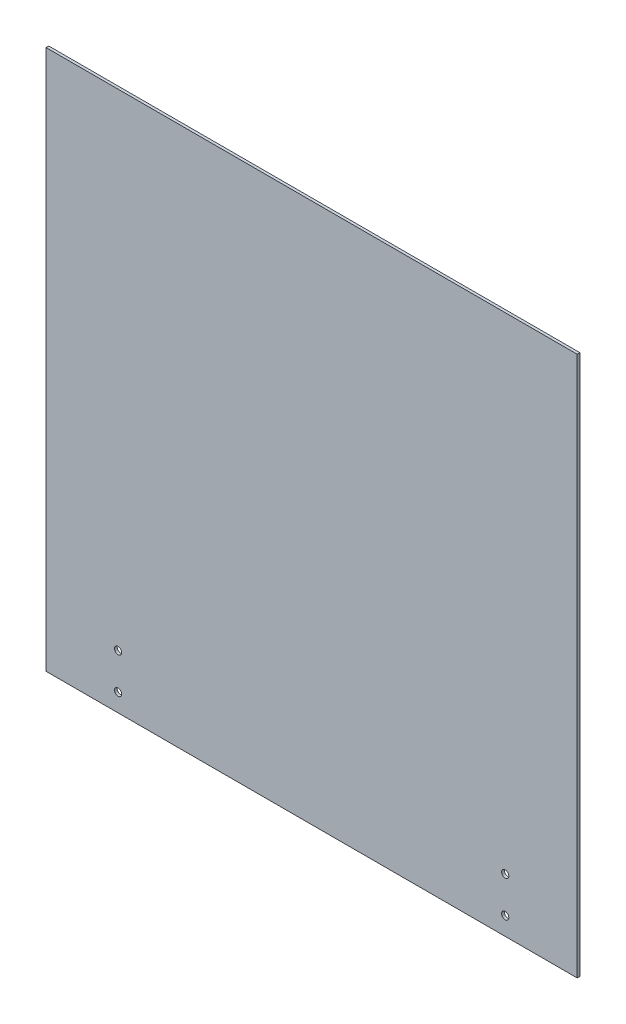
ISO-10303-21;
HEADER;
FILE_DESCRIPTION(('STEP AP214'),'2;1');
FILE_NAME('part.step','',(''),(''),'','','');
FILE_SCHEMA(('AUTOMOTIVE_DESIGN { 1 0 10303 214 1 1 1 1 }'));
ENDSEC;
DATA;
#1=APPLICATION_CONTEXT('core data for automotive mechanical design processes');
#2=APPLICATION_PROTOCOL_DEFINITION('international standard','automotive_design',2000,#1);
#3=PRODUCT_CONTEXT('',#1,'mechanical');
#4=PRODUCT('Part','Part','',(#3));
#5=PRODUCT_RELATED_PRODUCT_CATEGORY('part','',(#4));
#6=PRODUCT_DEFINITION_FORMATION('','',#4);
#7=PRODUCT_DEFINITION_CONTEXT('part definition',#1,'design');
#8=PRODUCT_DEFINITION('design','',#6,#7);
#9=PRODUCT_DEFINITION_SHAPE('','',#8);
#10=(LENGTH_UNIT() NAMED_UNIT(*) SI_UNIT(.MILLI.,.METRE.));
#11=(NAMED_UNIT(*) PLANE_ANGLE_UNIT() SI_UNIT($,.RADIAN.));
#12=(NAMED_UNIT(*) SI_UNIT($,.STERADIAN.) SOLID_ANGLE_UNIT());
#13=UNCERTAINTY_MEASURE_WITH_UNIT(LENGTH_MEASURE(1.E-05),#10,'distance_accuracy_value','');
#14=(GEOMETRIC_REPRESENTATION_CONTEXT(3) GLOBAL_UNCERTAINTY_ASSIGNED_CONTEXT((#13)) GLOBAL_UNIT_ASSIGNED_CONTEXT((#10,
#11,#12)) REPRESENTATION_CONTEXT('',''));
#15=CARTESIAN_POINT('',(0.,0.,0.));
#16=DIRECTION('',(0.,0.,1.));
#17=DIRECTION('',(1.,0.,0.));
#18=AXIS2_PLACEMENT_3D('',#15,#16,#17);
#19=CARTESIAN_POINT('',(147.5,-150.,-1.5));
#20=DIRECTION('',(1.,0.,0.));
#21=DIRECTION('',(0.,0.,-1.));
#22=AXIS2_PLACEMENT_3D('',#19,#20,#21);
#23=PLANE('',#22);
#24=DIRECTION('',(0.,1.,0.));
#25=VECTOR('',#24,1.);
#26=CARTESIAN_POINT('',(147.5,-150.,0.));
#27=LINE('',#26,#25);
#28=CARTESIAN_POINT('',(147.5,-150.,0.));
#29=VERTEX_POINT('',#28);
#30=CARTESIAN_POINT('',(147.5,150.,0.));
#31=VERTEX_POINT('',#30);
#32=EDGE_CURVE('E104',#29,#31,#27,.T.);
#33=ORIENTED_EDGE('',*,*,#32,.F.);
#34=DIRECTION('',(0.,0.,1.));
#35=VECTOR('',#34,1.);
#36=CARTESIAN_POINT('',(147.5,-150.,-1.5));
#37=LINE('',#36,#35);
#38=CARTESIAN_POINT('',(147.5,-150.,-1.5));
#39=VERTEX_POINT('',#38);
#40=EDGE_CURVE('E11',#39,#29,#37,.T.);
#41=ORIENTED_EDGE('',*,*,#40,.F.);
#42=DIRECTION('',(0.,1.,0.));
#43=VECTOR('',#42,1.);
#44=CARTESIAN_POINT('',(147.5,-150.,-1.5));
#45=LINE('',#44,#43);
#46=CARTESIAN_POINT('',(147.5,150.,-1.5));
#47=VERTEX_POINT('',#46);
#48=EDGE_CURVE('E97',#39,#47,#45,.T.);
#49=ORIENTED_EDGE('',*,*,#48,.T.);
#50=DIRECTION('',(0.,0.,1.));
#51=VECTOR('',#50,1.);
#52=CARTESIAN_POINT('',(147.5,150.,-1.5));
#53=LINE('',#52,#51);
#54=EDGE_CURVE('E42',#47,#31,#53,.T.);
#55=ORIENTED_EDGE('',*,*,#54,.T.);
#56=EDGE_LOOP('',(#33,#41,#49,#55));
#57=FACE_BOUND('',#56,.T.);
#58=ADVANCED_FACE('F39',(#57),#23,.T.);
#59=CARTESIAN_POINT('',(-147.5,-150.,-1.5));
#60=DIRECTION('',(0.,-1.,0.));
#61=DIRECTION('',(0.,0.,-1.));
#62=AXIS2_PLACEMENT_3D('',#59,#60,#61);
#63=PLANE('',#62);
#64=DIRECTION('',(1.,0.,0.));
#65=VECTOR('',#64,1.);
#66=CARTESIAN_POINT('',(-147.5,-150.,0.));
#67=LINE('',#66,#65);
#68=CARTESIAN_POINT('',(-147.5,-150.,0.));
#69=VERTEX_POINT('',#68);
#70=EDGE_CURVE('E99',#69,#29,#67,.T.);
#71=ORIENTED_EDGE('',*,*,#70,.F.);
#72=DIRECTION('',(0.,0.,1.));
#73=VECTOR('',#72,1.);
#74=CARTESIAN_POINT('',(-147.5,-150.,-1.5));
#75=LINE('',#74,#73);
#76=CARTESIAN_POINT('',(-147.5,-150.,-1.5));
#77=VERTEX_POINT('',#76);
#78=EDGE_CURVE('E48',#77,#69,#75,.T.);
#79=ORIENTED_EDGE('',*,*,#78,.F.);
#80=DIRECTION('',(1.,0.,0.));
#81=VECTOR('',#80,1.);
#82=CARTESIAN_POINT('',(-147.5,-150.,-1.5));
#83=LINE('',#82,#81);
#84=EDGE_CURVE('E94',#77,#39,#83,.T.);
#85=ORIENTED_EDGE('',*,*,#84,.T.);
#86=ORIENTED_EDGE('',*,*,#40,.T.);
#87=EDGE_LOOP('',(#71,#79,#85,#86));
#88=FACE_BOUND('',#87,.T.);
#89=ADVANCED_FACE('F115',(#88),#63,.T.);
#90=CARTESIAN_POINT('',(-147.5,-150.,-1.5));
#91=DIRECTION('',(-1.,0.,0.));
#92=DIRECTION('',(0.,0.,1.));
#93=AXIS2_PLACEMENT_3D('',#90,#91,#92);
#94=PLANE('',#93);
#95=DIRECTION('',(0.,-1.,0.));
#96=VECTOR('',#95,1.);
#97=CARTESIAN_POINT('',(-147.5,-150.,0.));
#98=LINE('',#97,#96);
#99=CARTESIAN_POINT('',(-147.5,150.,0.));
#100=VERTEX_POINT('',#99);
#101=EDGE_CURVE('E89',#100,#69,#98,.T.);
#102=ORIENTED_EDGE('',*,*,#101,.F.);
#103=DIRECTION('',(0.,0.,1.));
#104=VECTOR('',#103,1.);
#105=CARTESIAN_POINT('',(-147.5,150.,-1.5));
#106=LINE('',#105,#104);
#107=CARTESIAN_POINT('',(-147.5,150.,-1.5));
#108=VERTEX_POINT('',#107);
#109=EDGE_CURVE('E84',#108,#100,#106,.T.);
#110=ORIENTED_EDGE('',*,*,#109,.F.);
#111=DIRECTION('',(0.,-1.,0.));
#112=VECTOR('',#111,1.);
#113=CARTESIAN_POINT('',(-147.5,-150.,-1.5));
#114=LINE('',#113,#112);
#115=EDGE_CURVE('E87',#108,#77,#114,.T.);
#116=ORIENTED_EDGE('',*,*,#115,.T.);
#117=ORIENTED_EDGE('',*,*,#78,.T.);
#118=EDGE_LOOP('',(#102,#110,#116,#117));
#119=FACE_BOUND('',#118,.T.);
#120=ADVANCED_FACE('F86',(#119),#94,.T.);
#121=CARTESIAN_POINT('',(-147.5,150.,-1.5));
#122=DIRECTION('',(0.,1.,0.));
#123=DIRECTION('',(0.,0.,1.));
#124=AXIS2_PLACEMENT_3D('',#121,#122,#123);
#125=PLANE('',#124);
#126=DIRECTION('',(-1.,0.,0.));
#127=VECTOR('',#126,1.);
#128=CARTESIAN_POINT('',(-147.5,150.,0.));
#129=LINE('',#128,#127);
#130=EDGE_CURVE('E107',#31,#100,#129,.T.);
#131=ORIENTED_EDGE('',*,*,#130,.F.);
#132=ORIENTED_EDGE('',*,*,#54,.F.);
#133=DIRECTION('',(-1.,0.,0.));
#134=VECTOR('',#133,1.);
#135=CARTESIAN_POINT('',(-147.5,150.,-1.5));
#136=LINE('',#135,#134);
#137=EDGE_CURVE('E93',#47,#108,#136,.T.);
#138=ORIENTED_EDGE('',*,*,#137,.T.);
#139=ORIENTED_EDGE('',*,*,#109,.T.);
#140=EDGE_LOOP('',(#131,#132,#138,#139));
#141=FACE_BOUND('',#140,.T.);
#142=ADVANCED_FACE('F96',(#141),#125,.T.);
#143=CARTESIAN_POINT('',(0.,0.,-1.5));
#144=DIRECTION('',(0.,0.,-1.));
#145=DIRECTION('',(-1.,0.,0.));
#146=AXIS2_PLACEMENT_3D('',#143,#144,#145);
#147=PLANE('',#146);
#148=CARTESIAN_POINT('',(-107.5,-140.,-1.5));
#149=DIRECTION('',(0.,0.,1.));
#150=DIRECTION('',(1.,0.,0.));
#151=AXIS2_PLACEMENT_3D('',#148,#149,#150);
#152=CIRCLE('',#151,2.);
#153=CARTESIAN_POINT('',(-105.5,-140.,-1.5));
#154=VERTEX_POINT('',#153);
#155=EDGE_CURVE('E156',#154,#154,#152,.T.);
#156=ORIENTED_EDGE('',*,*,#155,.T.);
#157=EDGE_LOOP('',(#156));
#158=FACE_BOUND('',#157,.T.);
#159=CARTESIAN_POINT('',(-107.5,-120.,-1.5));
#160=DIRECTION('',(0.,0.,1.));
#161=DIRECTION('',(1.,0.,0.));
#162=AXIS2_PLACEMENT_3D('',#159,#160,#161);
#163=CIRCLE('',#162,2.);
#164=CARTESIAN_POINT('',(-105.5,-120.,-1.5));
#165=VERTEX_POINT('',#164);
#166=EDGE_CURVE('E164',#165,#165,#163,.T.);
#167=ORIENTED_EDGE('',*,*,#166,.T.);
#168=EDGE_LOOP('',(#167));
#169=FACE_BOUND('',#168,.T.);
#170=CARTESIAN_POINT('',(107.5,-120.,-1.5));
#171=DIRECTION('',(0.,0.,1.));
#172=DIRECTION('',(1.,0.,0.));
#173=AXIS2_PLACEMENT_3D('',#170,#171,#172);
#174=CIRCLE('',#173,2.);
#175=CARTESIAN_POINT('',(109.5,-120.,-1.5));
#176=VERTEX_POINT('',#175);
#177=EDGE_CURVE('E170',#176,#176,#174,.T.);
#178=ORIENTED_EDGE('',*,*,#177,.T.);
#179=EDGE_LOOP('',(#178));
#180=FACE_BOUND('',#179,.T.);
#181=CARTESIAN_POINT('',(107.5,-140.,-1.5));
#182=DIRECTION('',(0.,0.,1.));
#183=DIRECTION('',(1.,0.,0.));
#184=AXIS2_PLACEMENT_3D('',#181,#182,#183);
#185=CIRCLE('',#184,2.);
#186=CARTESIAN_POINT('',(109.5,-140.,-1.5));
#187=VERTEX_POINT('',#186);
#188=EDGE_CURVE('E108',#187,#187,#185,.T.);
#189=ORIENTED_EDGE('',*,*,#188,.T.);
#190=EDGE_LOOP('',(#189));
#191=FACE_BOUND('',#190,.T.);
#192=ORIENTED_EDGE('',*,*,#48,.F.);
#193=ORIENTED_EDGE('',*,*,#84,.F.);
#194=ORIENTED_EDGE('',*,*,#115,.F.);
#195=ORIENTED_EDGE('',*,*,#137,.F.);
#196=EDGE_LOOP('',(#192,#193,#194,#195));
#197=FACE_BOUND('',#196,.T.);
#198=ADVANCED_FACE('F92',(#158,#169,#180,#191,#197),#147,.T.);
#199=CARTESIAN_POINT('',(0.,0.,0.));
#200=DIRECTION('',(0.,0.,-1.));
#201=DIRECTION('',(-1.,0.,0.));
#202=AXIS2_PLACEMENT_3D('',#199,#200,#201);
#203=PLANE('',#202);
#204=CARTESIAN_POINT('',(-107.5,-140.,0.));
#205=DIRECTION('',(0.,0.,1.));
#206=DIRECTION('',(1.,0.,0.));
#207=AXIS2_PLACEMENT_3D('',#204,#205,#206);
#208=CIRCLE('',#207,2.);
#209=CARTESIAN_POINT('',(-105.5,-140.,0.));
#210=VERTEX_POINT('',#209);
#211=EDGE_CURVE('E159',#210,#210,#208,.T.);
#212=ORIENTED_EDGE('',*,*,#211,.F.);
#213=EDGE_LOOP('',(#212));
#214=FACE_BOUND('',#213,.T.);
#215=CARTESIAN_POINT('',(-107.5,-120.,0.));
#216=DIRECTION('',(0.,0.,1.));
#217=DIRECTION('',(1.,0.,0.));
#218=AXIS2_PLACEMENT_3D('',#215,#216,#217);
#219=CIRCLE('',#218,2.);
#220=CARTESIAN_POINT('',(-105.5,-120.,0.));
#221=VERTEX_POINT('',#220);
#222=EDGE_CURVE('E161',#221,#221,#219,.T.);
#223=ORIENTED_EDGE('',*,*,#222,.F.);
#224=EDGE_LOOP('',(#223));
#225=FACE_BOUND('',#224,.T.);
#226=CARTESIAN_POINT('',(107.5,-120.,0.));
#227=DIRECTION('',(0.,0.,1.));
#228=DIRECTION('',(1.,0.,0.));
#229=AXIS2_PLACEMENT_3D('',#226,#227,#228);
#230=CIRCLE('',#229,2.);
#231=CARTESIAN_POINT('',(109.5,-120.,0.));
#232=VERTEX_POINT('',#231);
#233=EDGE_CURVE('E167',#232,#232,#230,.T.);
#234=ORIENTED_EDGE('',*,*,#233,.F.);
#235=EDGE_LOOP('',(#234));
#236=FACE_BOUND('',#235,.T.);
#237=CARTESIAN_POINT('',(107.5,-140.,0.));
#238=DIRECTION('',(0.,0.,1.));
#239=DIRECTION('',(1.,0.,0.));
#240=AXIS2_PLACEMENT_3D('',#237,#238,#239);
#241=CIRCLE('',#240,2.);
#242=CARTESIAN_POINT('',(109.5,-140.,0.));
#243=VERTEX_POINT('',#242);
#244=EDGE_CURVE('E173',#243,#243,#241,.T.);
#245=ORIENTED_EDGE('',*,*,#244,.F.);
#246=EDGE_LOOP('',(#245));
#247=FACE_BOUND('',#246,.T.);
#248=ORIENTED_EDGE('',*,*,#32,.T.);
#249=ORIENTED_EDGE('',*,*,#130,.T.);
#250=ORIENTED_EDGE('',*,*,#101,.T.);
#251=ORIENTED_EDGE('',*,*,#70,.T.);
#252=EDGE_LOOP('',(#248,#249,#250,#251));
#253=FACE_BOUND('',#252,.T.);
#254=ADVANCED_FACE('F114',(#214,#225,#236,#247,#253),#203,.F.);
#255=CARTESIAN_POINT('',(107.5,-140.,-1.5));
#256=DIRECTION('',(0.,0.,1.));
#257=DIRECTION('',(1.,0.,0.));
#258=AXIS2_PLACEMENT_3D('',#255,#256,#257);
#259=CYLINDRICAL_SURFACE('',#258,2.);
#260=ORIENTED_EDGE('',*,*,#188,.F.);
#261=EDGE_LOOP('',(#260));
#262=FACE_BOUND('',#261,.T.);
#263=ORIENTED_EDGE('',*,*,#244,.T.);
#264=EDGE_LOOP('',(#263));
#265=FACE_BOUND('',#264,.T.);
#266=ADVANCED_FACE('F133',(#262,#265),#259,.F.);
#267=CARTESIAN_POINT('',(107.5,-120.,-1.5));
#268=DIRECTION('',(0.,0.,1.));
#269=DIRECTION('',(1.,0.,0.));
#270=AXIS2_PLACEMENT_3D('',#267,#268,#269);
#271=CYLINDRICAL_SURFACE('',#270,2.);
#272=ORIENTED_EDGE('',*,*,#177,.F.);
#273=EDGE_LOOP('',(#272));
#274=FACE_BOUND('',#273,.T.);
#275=ORIENTED_EDGE('',*,*,#233,.T.);
#276=EDGE_LOOP('',(#275));
#277=FACE_BOUND('',#276,.T.);
#278=ADVANCED_FACE('F140',(#274,#277),#271,.F.);
#279=CARTESIAN_POINT('',(-107.5,-120.,-1.5));
#280=DIRECTION('',(0.,0.,1.));
#281=DIRECTION('',(1.,0.,0.));
#282=AXIS2_PLACEMENT_3D('',#279,#280,#281);
#283=CYLINDRICAL_SURFACE('',#282,2.);
#284=ORIENTED_EDGE('',*,*,#166,.F.);
#285=EDGE_LOOP('',(#284));
#286=FACE_BOUND('',#285,.T.);
#287=ORIENTED_EDGE('',*,*,#222,.T.);
#288=EDGE_LOOP('',(#287));
#289=FACE_BOUND('',#288,.T.);
#290=ADVANCED_FACE('F144',(#286,#289),#283,.F.);
#291=CARTESIAN_POINT('',(-107.5,-140.,-1.5));
#292=DIRECTION('',(0.,0.,1.));
#293=DIRECTION('',(1.,0.,0.));
#294=AXIS2_PLACEMENT_3D('',#291,#292,#293);
#295=CYLINDRICAL_SURFACE('',#294,2.);
#296=ORIENTED_EDGE('',*,*,#155,.F.);
#297=EDGE_LOOP('',(#296));
#298=FACE_BOUND('',#297,.T.);
#299=ORIENTED_EDGE('',*,*,#211,.T.);
#300=EDGE_LOOP('',(#299));
#301=FACE_BOUND('',#300,.T.);
#302=ADVANCED_FACE('F148',(#298,#301),#295,.F.);
#303=CLOSED_SHELL('',(#58,#89,#120,#142,#198,#254,#266,#278,#290,#302));
#304=MANIFOLD_SOLID_BREP('B2',#303);
#305=ADVANCED_BREP_SHAPE_REPRESENTATION('',(#18,#304),#14);
#306=SHAPE_DEFINITION_REPRESENTATION(#9,#305);
ENDSEC;
END-ISO-10303-21;
